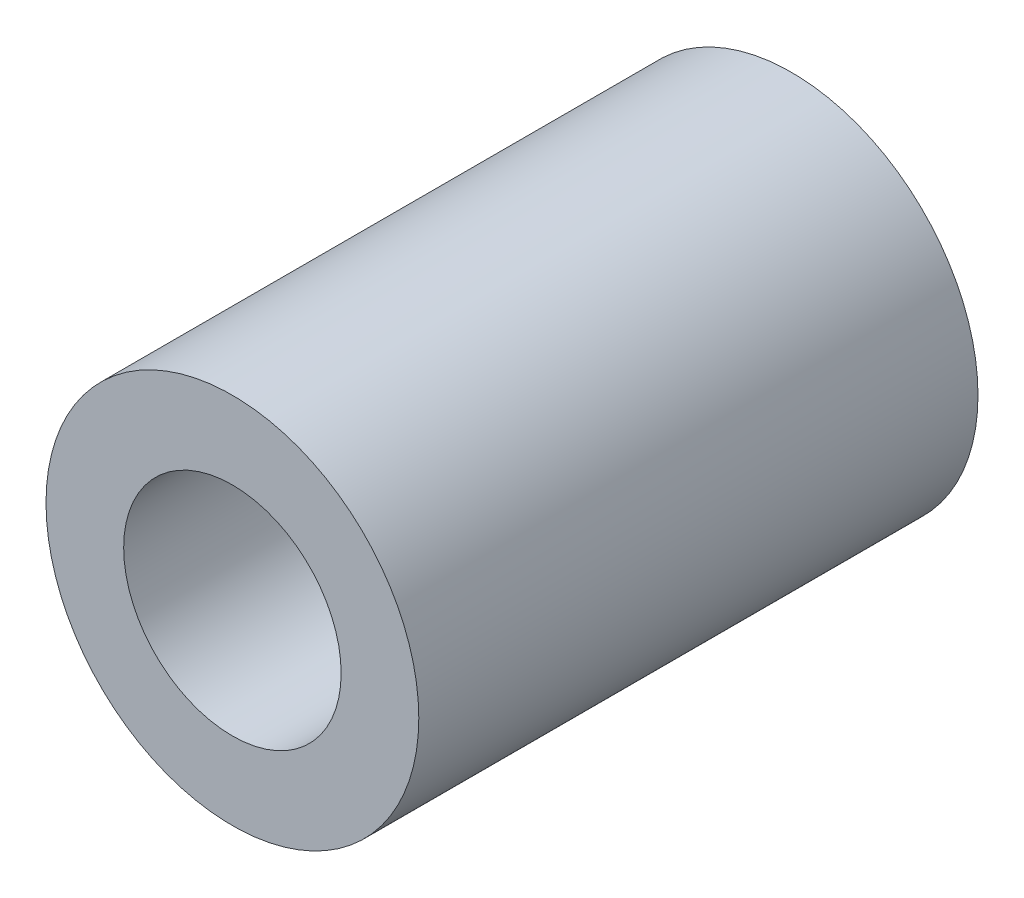
ISO-10303-21;
HEADER;
FILE_DESCRIPTION(('STEP AP214'),'2;1');
FILE_NAME('part.step','',(''),(''),'','','');
FILE_SCHEMA(('AUTOMOTIVE_DESIGN { 1 0 10303 214 1 1 1 1 }'));
ENDSEC;
DATA;
#1=APPLICATION_CONTEXT('core data for automotive mechanical design processes');
#2=APPLICATION_PROTOCOL_DEFINITION('international standard','automotive_design',2000,#1);
#3=PRODUCT_CONTEXT('',#1,'mechanical');
#4=PRODUCT('Part','Part','',(#3));
#5=PRODUCT_RELATED_PRODUCT_CATEGORY('part','',(#4));
#6=PRODUCT_DEFINITION_FORMATION('','',#4);
#7=PRODUCT_DEFINITION_CONTEXT('part definition',#1,'design');
#8=PRODUCT_DEFINITION('design','',#6,#7);
#9=PRODUCT_DEFINITION_SHAPE('','',#8);
#10=(LENGTH_UNIT() NAMED_UNIT(*) SI_UNIT(.MILLI.,.METRE.));
#11=(NAMED_UNIT(*) PLANE_ANGLE_UNIT() SI_UNIT($,.RADIAN.));
#12=(NAMED_UNIT(*) SI_UNIT($,.STERADIAN.) SOLID_ANGLE_UNIT());
#13=UNCERTAINTY_MEASURE_WITH_UNIT(LENGTH_MEASURE(1.E-05),#10,'distance_accuracy_value','');
#14=(GEOMETRIC_REPRESENTATION_CONTEXT(3) GLOBAL_UNCERTAINTY_ASSIGNED_CONTEXT((#13)) GLOBAL_UNIT_ASSIGNED_CONTEXT((#10,
#11,#12)) REPRESENTATION_CONTEXT('',''));
#15=CARTESIAN_POINT('',(0.,0.,0.));
#16=DIRECTION('',(0.,0.,1.));
#17=DIRECTION('',(1.,0.,0.));
#18=AXIS2_PLACEMENT_3D('',#15,#16,#17);
#19=CARTESIAN_POINT('',(2.30447602689268,0.806470296454291,10.));
#20=DIRECTION('',(0.,0.,1.));
#21=DIRECTION('',(1.,0.,0.));
#22=AXIS2_PLACEMENT_3D('',#19,#20,#21);
#23=PLANE('',#22);
#24=CARTESIAN_POINT('',(1.13780936022601,0.806470296454291,10.));
#25=DIRECTION('',(0.,0.,1.));
#26=DIRECTION('',(1.,0.,0.));
#27=AXIS2_PLACEMENT_3D('',#24,#25,#26);
#28=CIRCLE('',#27,2.);
#29=CARTESIAN_POINT('',(3.13780936022601,0.806470296454291,10.));
#30=VERTEX_POINT('',#29);
#31=EDGE_CURVE('E10',#30,#30,#28,.T.);
#32=ORIENTED_EDGE('',*,*,#31,.T.);
#33=EDGE_LOOP('',(#32));
#34=FACE_BOUND('',#33,.T.);
#35=CARTESIAN_POINT('',(1.13780936022601,0.806470296454291,10.));
#36=DIRECTION('',(0.,0.,1.));
#37=DIRECTION('',(1.,0.,0.));
#38=AXIS2_PLACEMENT_3D('',#35,#36,#37);
#39=CIRCLE('',#38,1.16666666666667);
#40=CARTESIAN_POINT('',(2.30447602689268,0.806470296454291,10.));
#41=VERTEX_POINT('',#40);
#42=EDGE_CURVE('E49',#41,#41,#39,.T.);
#43=ORIENTED_EDGE('',*,*,#42,.F.);
#44=EDGE_LOOP('',(#43));
#45=FACE_BOUND('',#44,.T.);
#46=ADVANCED_FACE('F35',(#34,#45),#23,.T.);
#47=CARTESIAN_POINT('',(1.13780936022601,0.806470296454291,0.));
#48=DIRECTION('',(0.,0.,1.));
#49=DIRECTION('',(1.,0.,0.));
#50=AXIS2_PLACEMENT_3D('',#47,#48,#49);
#51=CYLINDRICAL_SURFACE('',#50,2.);
#52=CARTESIAN_POINT('',(1.13780936022601,0.806470296454291,4.));
#53=DIRECTION('',(0.,0.,1.));
#54=DIRECTION('',(1.,0.,0.));
#55=AXIS2_PLACEMENT_3D('',#52,#53,#54);
#56=CIRCLE('',#55,2.);
#57=CARTESIAN_POINT('',(3.13780936022601,0.806470296454291,4.));
#58=VERTEX_POINT('',#57);
#59=EDGE_CURVE('E41',#58,#58,#56,.T.);
#60=ORIENTED_EDGE('',*,*,#59,.T.);
#61=EDGE_LOOP('',(#60));
#62=FACE_BOUND('',#61,.T.);
#63=ORIENTED_EDGE('',*,*,#31,.F.);
#64=EDGE_LOOP('',(#63));
#65=FACE_BOUND('',#64,.T.);
#66=ADVANCED_FACE('F59',(#62,#65),#51,.T.);
#67=CARTESIAN_POINT('',(3.13780936022601,0.806470296454291,4.));
#68=DIRECTION('',(0.,0.,-1.));
#69=DIRECTION('',(-1.,0.,0.));
#70=AXIS2_PLACEMENT_3D('',#67,#68,#69);
#71=PLANE('',#70);
#72=CARTESIAN_POINT('',(1.13780936022601,0.806470296454291,4.));
#73=DIRECTION('',(0.,0.,1.));
#74=DIRECTION('',(1.,0.,0.));
#75=AXIS2_PLACEMENT_3D('',#72,#73,#74);
#76=CIRCLE('',#75,1.16666666666667);
#77=CARTESIAN_POINT('',(2.30447602689268,0.806470296454291,4.));
#78=VERTEX_POINT('',#77);
#79=EDGE_CURVE('E45',#78,#78,#76,.T.);
#80=ORIENTED_EDGE('',*,*,#79,.T.);
#81=EDGE_LOOP('',(#80));
#82=FACE_BOUND('',#81,.T.);
#83=ORIENTED_EDGE('',*,*,#59,.F.);
#84=EDGE_LOOP('',(#83));
#85=FACE_BOUND('',#84,.T.);
#86=ADVANCED_FACE('F63',(#82,#85),#71,.T.);
#87=CARTESIAN_POINT('',(1.13780936022601,0.806470296454291,0.));
#88=DIRECTION('',(0.,0.,1.));
#89=DIRECTION('',(1.,0.,0.));
#90=AXIS2_PLACEMENT_3D('',#87,#88,#89);
#91=CYLINDRICAL_SURFACE('',#90,1.16666666666667);
#92=ORIENTED_EDGE('',*,*,#42,.T.);
#93=EDGE_LOOP('',(#92));
#94=FACE_BOUND('',#93,.T.);
#95=ORIENTED_EDGE('',*,*,#79,.F.);
#96=EDGE_LOOP('',(#95));
#97=FACE_BOUND('',#96,.T.);
#98=ADVANCED_FACE('F55',(#94,#97),#91,.F.);
#99=CLOSED_SHELL('',(#46,#66,#86,#98));
#100=MANIFOLD_SOLID_BREP('B2',#99);
#101=ADVANCED_BREP_SHAPE_REPRESENTATION('',(#18,#100),#14);
#102=SHAPE_DEFINITION_REPRESENTATION(#9,#101);
ENDSEC;
END-ISO-10303-21;
